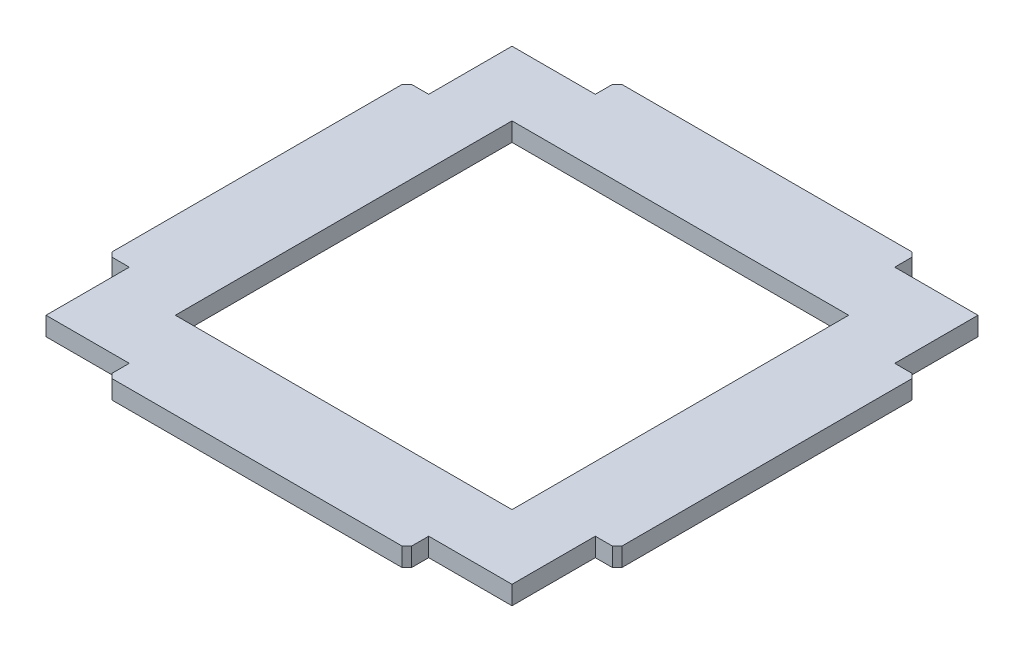
ISO-10303-21;
HEADER;
FILE_DESCRIPTION(('STEP AP214'),'2;1');
FILE_NAME('part.step','',(''),(''),'','','');
FILE_SCHEMA(('AUTOMOTIVE_DESIGN { 1 0 10303 214 1 1 1 1 }'));
ENDSEC;
DATA;
#1=APPLICATION_CONTEXT('core data for automotive mechanical design processes');
#2=APPLICATION_PROTOCOL_DEFINITION('international standard','automotive_design',2000,#1);
#3=PRODUCT_CONTEXT('',#1,'mechanical');
#4=PRODUCT('Part','Part','',(#3));
#5=PRODUCT_RELATED_PRODUCT_CATEGORY('part','',(#4));
#6=PRODUCT_DEFINITION_FORMATION('','',#4);
#7=PRODUCT_DEFINITION_CONTEXT('part definition',#1,'design');
#8=PRODUCT_DEFINITION('design','',#6,#7);
#9=PRODUCT_DEFINITION_SHAPE('','',#8);
#10=(LENGTH_UNIT() NAMED_UNIT(*) SI_UNIT(.MILLI.,.METRE.));
#11=(NAMED_UNIT(*) PLANE_ANGLE_UNIT() SI_UNIT($,.RADIAN.));
#12=(NAMED_UNIT(*) SI_UNIT($,.STERADIAN.) SOLID_ANGLE_UNIT());
#13=UNCERTAINTY_MEASURE_WITH_UNIT(LENGTH_MEASURE(1.E-05),#10,'distance_accuracy_value','');
#14=(GEOMETRIC_REPRESENTATION_CONTEXT(3) GLOBAL_UNCERTAINTY_ASSIGNED_CONTEXT((#13)) GLOBAL_UNIT_ASSIGNED_CONTEXT((#10,
#11,#12)) REPRESENTATION_CONTEXT('',''));
#15=CARTESIAN_POINT('',(0.,0.,0.));
#16=DIRECTION('',(0.,0.,1.));
#17=DIRECTION('',(1.,0.,0.));
#18=AXIS2_PLACEMENT_3D('',#15,#16,#17);
#19=CARTESIAN_POINT('',(0.,4.064,0.));
#20=DIRECTION('',(0.,-1.,0.));
#21=DIRECTION('',(0.,0.,-1.));
#22=AXIS2_PLACEMENT_3D('',#19,#20,#21);
#23=PLANE('',#22);
#24=DIRECTION('',(0.,0.,1.));
#25=VECTOR('',#24,1.);
#26=CARTESIAN_POINT('',(417.83,4.064,-32.6389999999995));
#27=LINE('',#26,#25);
#28=CARTESIAN_POINT('',(417.83,4.064,-31.6229999999996));
#29=VERTEX_POINT('',#28);
#30=CARTESIAN_POINT('',(417.83,4.064,31.6229999999998));
#31=VERTEX_POINT('',#30);
#32=EDGE_CURVE('E320',#29,#31,#27,.T.);
#33=ORIENTED_EDGE('',*,*,#32,.T.);
#34=DIRECTION('',(-0.707106781186552,0.,-0.707106781186543));
#35=VECTOR('',#34,1.);
#36=CARTESIAN_POINT('',(418.846000000001,4.064,32.6389999999998));
#37=LINE('',#36,#35);
#38=CARTESIAN_POINT('',(418.846000000001,4.064,32.6389999999998));
#39=VERTEX_POINT('',#38);
#40=EDGE_CURVE('E455',#31,#39,#37,.F.);
#41=ORIENTED_EDGE('',*,*,#40,.T.);
#42=DIRECTION('',(1.,0.,0.));
#43=VECTOR('',#42,1.);
#44=CARTESIAN_POINT('',(417.83,4.064,32.6389999999998));
#45=LINE('',#44,#43);
#46=CARTESIAN_POINT('',(422.5925,4.064,32.6389999999998));
#47=VERTEX_POINT('',#46);
#48=EDGE_CURVE('E323',#39,#47,#45,.T.);
#49=ORIENTED_EDGE('',*,*,#48,.T.);
#50=DIRECTION('',(0.,0.,1.));
#51=VECTOR('',#50,1.);
#52=CARTESIAN_POINT('',(422.592500000001,4.064,50.8));
#53=LINE('',#52,#51);
#54=CARTESIAN_POINT('',(422.592500000001,4.064,50.8));
#55=VERTEX_POINT('',#54);
#56=EDGE_CURVE('E325',#47,#55,#53,.T.);
#57=ORIENTED_EDGE('',*,*,#56,.T.);
#58=DIRECTION('',(1.,0.,0.));
#59=VECTOR('',#58,1.);
#60=CARTESIAN_POINT('',(440.753500000001,4.064,50.8));
#61=LINE('',#60,#59);
#62=CARTESIAN_POINT('',(440.753500000001,4.064,50.8));
#63=VERTEX_POINT('',#62);
#64=EDGE_CURVE('E327',#55,#63,#61,.T.);
#65=ORIENTED_EDGE('',*,*,#64,.T.);
#66=DIRECTION('',(0.,0.,1.));
#67=VECTOR('',#66,1.);
#68=CARTESIAN_POINT('',(440.753500000001,4.064,55.5625));
#69=LINE('',#68,#67);
#70=CARTESIAN_POINT('',(440.753500000001,4.064,54.5465));
#71=VERTEX_POINT('',#70);
#72=EDGE_CURVE('E329',#63,#71,#69,.T.);
#73=ORIENTED_EDGE('',*,*,#72,.T.);
#74=DIRECTION('',(-0.707106781186552,0.,-0.707106781186543));
#75=VECTOR('',#74,1.);
#76=CARTESIAN_POINT('',(441.769500000001,4.064,55.5625));
#77=LINE('',#76,#75);
#78=CARTESIAN_POINT('',(441.769500000001,4.064,55.5625));
#79=VERTEX_POINT('',#78);
#80=EDGE_CURVE('E453',#71,#79,#77,.F.);
#81=ORIENTED_EDGE('',*,*,#80,.T.);
#82=DIRECTION('',(1.,0.,0.));
#83=VECTOR('',#82,1.);
#84=CARTESIAN_POINT('',(440.753500000001,4.064,55.5625));
#85=LINE('',#84,#83);
#86=CARTESIAN_POINT('',(505.0155,4.064,55.5625));
#87=VERTEX_POINT('',#86);
#88=EDGE_CURVE('E332',#79,#87,#85,.T.);
#89=ORIENTED_EDGE('',*,*,#88,.T.);
#90=DIRECTION('',(-0.707106781186543,0.,0.707106781186552));
#91=VECTOR('',#90,1.);
#92=CARTESIAN_POINT('',(506.0315,4.064,54.5465));
#93=LINE('',#92,#91);
#94=CARTESIAN_POINT('',(506.0315,4.064,54.5465));
#95=VERTEX_POINT('',#94);
#96=EDGE_CURVE('E49',#87,#95,#93,.F.);
#97=ORIENTED_EDGE('',*,*,#96,.T.);
#98=DIRECTION('',(0.,0.,-1.));
#99=VECTOR('',#98,1.);
#100=CARTESIAN_POINT('',(506.0315,4.064,55.5625));
#101=LINE('',#100,#99);
#102=CARTESIAN_POINT('',(506.0315,4.064,50.8));
#103=VERTEX_POINT('',#102);
#104=EDGE_CURVE('E334',#95,#103,#101,.T.);
#105=ORIENTED_EDGE('',*,*,#104,.T.);
#106=DIRECTION('',(1.,0.,0.));
#107=VECTOR('',#106,1.);
#108=CARTESIAN_POINT('',(524.1925,4.064,50.8));
#109=LINE('',#108,#107);
#110=CARTESIAN_POINT('',(524.1925,4.064,50.8));
#111=VERTEX_POINT('',#110);
#112=EDGE_CURVE('E287',#103,#111,#109,.T.);
#113=ORIENTED_EDGE('',*,*,#112,.T.);
#114=DIRECTION('',(0.,0.,-1.));
#115=VECTOR('',#114,1.);
#116=CARTESIAN_POINT('',(524.1925,4.064,32.639));
#117=LINE('',#116,#115);
#118=CARTESIAN_POINT('',(524.1925,4.064,32.639));
#119=VERTEX_POINT('',#118);
#120=EDGE_CURVE('E290',#111,#119,#117,.T.);
#121=ORIENTED_EDGE('',*,*,#120,.T.);
#122=DIRECTION('',(1.,0.,0.));
#123=VECTOR('',#122,1.);
#124=CARTESIAN_POINT('',(528.955,4.064,32.639));
#125=LINE('',#124,#123);
#126=CARTESIAN_POINT('',(527.939,4.064,32.639));
#127=VERTEX_POINT('',#126);
#128=EDGE_CURVE('E293',#119,#127,#125,.T.);
#129=ORIENTED_EDGE('',*,*,#128,.T.);
#130=DIRECTION('',(-0.707106781186567,0.,0.707106781186528));
#131=VECTOR('',#130,1.);
#132=CARTESIAN_POINT('',(528.955,4.064,31.6229999999999));
#133=LINE('',#132,#131);
#134=CARTESIAN_POINT('',(528.955,4.064,31.6229999999999));
#135=VERTEX_POINT('',#134);
#136=EDGE_CURVE('E450',#127,#135,#133,.F.);
#137=ORIENTED_EDGE('',*,*,#136,.T.);
#138=DIRECTION('',(0.,0.,-1.));
#139=VECTOR('',#138,1.);
#140=CARTESIAN_POINT('',(528.955,4.064,32.639));
#141=LINE('',#140,#139);
#142=CARTESIAN_POINT('',(528.955,4.064,-31.6229999999994));
#143=VERTEX_POINT('',#142);
#144=EDGE_CURVE('E296',#135,#143,#141,.T.);
#145=ORIENTED_EDGE('',*,*,#144,.T.);
#146=DIRECTION('',(0.707106781186552,0.,0.707106781186543));
#147=VECTOR('',#146,1.);
#148=CARTESIAN_POINT('',(527.939000000001,4.064,-32.6389999999994));
#149=LINE('',#148,#147);
#150=CARTESIAN_POINT('',(527.939000000001,4.064,-32.6389999999994));
#151=VERTEX_POINT('',#150);
#152=EDGE_CURVE('E448',#143,#151,#149,.F.);
#153=ORIENTED_EDGE('',*,*,#152,.T.);
#154=DIRECTION('',(-1.,0.,0.));
#155=VECTOR('',#154,1.);
#156=CARTESIAN_POINT('',(528.955,4.064,-32.6389999999994));
#157=LINE('',#156,#155);
#158=CARTESIAN_POINT('',(524.1925,4.064,-32.6389999999994));
#159=VERTEX_POINT('',#158);
#160=EDGE_CURVE('E299',#151,#159,#157,.T.);
#161=ORIENTED_EDGE('',*,*,#160,.T.);
#162=DIRECTION('',(0.,0.,-1.));
#163=VECTOR('',#162,1.);
#164=CARTESIAN_POINT('',(524.1925,4.064,-50.8));
#165=LINE('',#164,#163);
#166=CARTESIAN_POINT('',(524.1925,4.064,-50.8));
#167=VERTEX_POINT('',#166);
#168=EDGE_CURVE('E301',#159,#167,#165,.T.);
#169=ORIENTED_EDGE('',*,*,#168,.T.);
#170=DIRECTION('',(-1.,0.,0.));
#171=VECTOR('',#170,1.);
#172=CARTESIAN_POINT('',(506.0315,4.064,-50.8));
#173=LINE('',#172,#171);
#174=CARTESIAN_POINT('',(506.0315,4.064,-50.8));
#175=VERTEX_POINT('',#174);
#176=EDGE_CURVE('E303',#167,#175,#173,.T.);
#177=ORIENTED_EDGE('',*,*,#176,.T.);
#178=DIRECTION('',(0.,0.,-1.));
#179=VECTOR('',#178,1.);
#180=CARTESIAN_POINT('',(506.0315,4.064,-55.5625));
#181=LINE('',#180,#179);
#182=CARTESIAN_POINT('',(506.0315,4.064,-54.5465));
#183=VERTEX_POINT('',#182);
#184=EDGE_CURVE('E305',#175,#183,#181,.T.);
#185=ORIENTED_EDGE('',*,*,#184,.T.);
#186=DIRECTION('',(0.707106781186557,0.,0.707106781186538));
#187=VECTOR('',#186,1.);
#188=CARTESIAN_POINT('',(505.0155,4.064,-55.5625));
#189=LINE('',#188,#187);
#190=CARTESIAN_POINT('',(505.0155,4.064,-55.5625));
#191=VERTEX_POINT('',#190);
#192=EDGE_CURVE('E446',#183,#191,#189,.F.);
#193=ORIENTED_EDGE('',*,*,#192,.T.);
#194=DIRECTION('',(-1.,0.,0.));
#195=VECTOR('',#194,1.);
#196=CARTESIAN_POINT('',(440.753500000001,4.064,-55.5625));
#197=LINE('',#196,#195);
#198=CARTESIAN_POINT('',(441.769500000001,4.064,-55.5625));
#199=VERTEX_POINT('',#198);
#200=EDGE_CURVE('E308',#191,#199,#197,.T.);
#201=ORIENTED_EDGE('',*,*,#200,.T.);
#202=DIRECTION('',(0.707106781186543,0.,-0.707106781186552));
#203=VECTOR('',#202,1.);
#204=CARTESIAN_POINT('',(440.753500000001,4.064,-54.5465));
#205=LINE('',#204,#203);
#206=CARTESIAN_POINT('',(440.753500000001,4.064,-54.5465));
#207=VERTEX_POINT('',#206);
#208=EDGE_CURVE('E442',#199,#207,#205,.F.);
#209=ORIENTED_EDGE('',*,*,#208,.T.);
#210=DIRECTION('',(0.,0.,1.));
#211=VECTOR('',#210,1.);
#212=CARTESIAN_POINT('',(440.753500000001,4.064,-55.5625));
#213=LINE('',#212,#211);
#214=CARTESIAN_POINT('',(440.753500000001,4.064,-50.8));
#215=VERTEX_POINT('',#214);
#216=EDGE_CURVE('E311',#207,#215,#213,.T.);
#217=ORIENTED_EDGE('',*,*,#216,.T.);
#218=DIRECTION('',(-1.,0.,0.));
#219=VECTOR('',#218,1.);
#220=CARTESIAN_POINT('',(422.592500000001,4.064,-50.8));
#221=LINE('',#220,#219);
#222=CARTESIAN_POINT('',(422.592500000001,4.064,-50.8));
#223=VERTEX_POINT('',#222);
#224=EDGE_CURVE('E313',#215,#223,#221,.T.);
#225=ORIENTED_EDGE('',*,*,#224,.T.);
#226=DIRECTION('',(0.,0.,1.));
#227=VECTOR('',#226,1.);
#228=CARTESIAN_POINT('',(422.5925,4.064,-32.6389999999995));
#229=LINE('',#228,#227);
#230=CARTESIAN_POINT('',(422.5925,4.064,-32.6389999999995));
#231=VERTEX_POINT('',#230);
#232=EDGE_CURVE('E315',#223,#231,#229,.T.);
#233=ORIENTED_EDGE('',*,*,#232,.T.);
#234=DIRECTION('',(-1.,0.,0.));
#235=VECTOR('',#234,1.);
#236=CARTESIAN_POINT('',(417.83,4.064,-32.6389999999995));
#237=LINE('',#236,#235);
#238=CARTESIAN_POINT('',(418.846,4.064,-32.6389999999995));
#239=VERTEX_POINT('',#238);
#240=EDGE_CURVE('E317',#231,#239,#237,.T.);
#241=ORIENTED_EDGE('',*,*,#240,.T.);
#242=DIRECTION('',(0.707106781186543,0.,-0.707106781186552));
#243=VECTOR('',#242,1.);
#244=CARTESIAN_POINT('',(417.83,4.064,-31.6229999999996));
#245=LINE('',#244,#243);
#246=EDGE_CURVE('E444',#239,#29,#245,.F.);
#247=ORIENTED_EDGE('',*,*,#246,.T.);
#248=EDGE_LOOP('',(#33,#41,#49,#57,#65,#73,#81,#89,#97,#105,#113,#121,#129,#137,#145,#153,#161,
#169,#177,#185,#193,#201,#209,#217,#225,#233,#241,#247));
#249=FACE_BOUND('',#248,.T.);
#250=DIRECTION('',(0.,0.,1.));
#251=VECTOR('',#250,1.);
#252=CARTESIAN_POINT('',(436.689500000001,4.064,-36.7029999999998));
#253=LINE('',#252,#251);
#254=CARTESIAN_POINT('',(436.689500000001,4.064,-36.7029999999998));
#255=VERTEX_POINT('',#254);
#256=CARTESIAN_POINT('',(436.689500000001,4.064,36.703));
#257=VERTEX_POINT('',#256);
#258=EDGE_CURVE('E246',#255,#257,#253,.T.);
#259=ORIENTED_EDGE('',*,*,#258,.F.);
#260=DIRECTION('',(-1.,0.,0.));
#261=VECTOR('',#260,1.);
#262=CARTESIAN_POINT('',(510.0955,4.064,-36.7029999999999));
#263=LINE('',#262,#261);
#264=CARTESIAN_POINT('',(510.0955,4.064,-36.7029999999999));
#265=VERTEX_POINT('',#264);
#266=EDGE_CURVE('E271',#265,#255,#263,.T.);
#267=ORIENTED_EDGE('',*,*,#266,.F.);
#268=DIRECTION('',(0.,0.,-1.));
#269=VECTOR('',#268,1.);
#270=CARTESIAN_POINT('',(510.0955,4.064,-36.7029999999999));
#271=LINE('',#270,#269);
#272=CARTESIAN_POINT('',(510.0955,4.064,36.703));
#273=VERTEX_POINT('',#272);
#274=EDGE_CURVE('E269',#273,#265,#271,.T.);
#275=ORIENTED_EDGE('',*,*,#274,.F.);
#276=DIRECTION('',(1.,0.,0.));
#277=VECTOR('',#276,1.);
#278=CARTESIAN_POINT('',(510.0955,4.064,36.703));
#279=LINE('',#278,#277);
#280=EDGE_CURVE('E256',#257,#273,#279,.T.);
#281=ORIENTED_EDGE('',*,*,#280,.F.);
#282=EDGE_LOOP('',(#259,#267,#275,#281));
#283=FACE_BOUND('',#282,.T.);
#284=ADVANCED_FACE('F34',(#249,#283),#23,.F.);
#285=CARTESIAN_POINT('',(0.,0.,0.));
#286=DIRECTION('',(0.,-1.,0.));
#287=DIRECTION('',(0.,0.,-1.));
#288=AXIS2_PLACEMENT_3D('',#285,#286,#287);
#289=PLANE('',#288);
#290=DIRECTION('',(1.,0.,0.));
#291=VECTOR('',#290,1.);
#292=CARTESIAN_POINT('',(417.83,0.,32.6389999999998));
#293=LINE('',#292,#291);
#294=CARTESIAN_POINT('',(418.846000000001,0.,32.6389999999998));
#295=VERTEX_POINT('',#294);
#296=CARTESIAN_POINT('',(422.5925,0.,32.6389999999998));
#297=VERTEX_POINT('',#296);
#298=EDGE_CURVE('E371',#295,#297,#293,.T.);
#299=ORIENTED_EDGE('',*,*,#298,.F.);
#300=DIRECTION('',(0.707106781186552,0.,0.707106781186543));
#301=VECTOR('',#300,1.);
#302=CARTESIAN_POINT('',(193.103499999997,0.,-193.1035));
#303=LINE('',#302,#301);
#304=CARTESIAN_POINT('',(417.83,0.,31.6229999999998));
#305=VERTEX_POINT('',#304);
#306=EDGE_CURVE('E435',#295,#305,#303,.F.);
#307=ORIENTED_EDGE('',*,*,#306,.T.);
#308=DIRECTION('',(0.,0.,1.));
#309=VECTOR('',#308,1.);
#310=CARTESIAN_POINT('',(417.83,0.,-32.6389999999995));
#311=LINE('',#310,#309);
#312=CARTESIAN_POINT('',(417.83,0.,-31.6229999999996));
#313=VERTEX_POINT('',#312);
#314=EDGE_CURVE('E368',#313,#305,#311,.T.);
#315=ORIENTED_EDGE('',*,*,#314,.F.);
#316=DIRECTION('',(-0.707106781186543,0.,0.707106781186552));
#317=VECTOR('',#316,1.);
#318=CARTESIAN_POINT('',(193.103500000003,0.,193.103500000001));
#319=LINE('',#318,#317);
#320=CARTESIAN_POINT('',(418.846,0.,-32.6389999999995));
#321=VERTEX_POINT('',#320);
#322=EDGE_CURVE('E423',#313,#321,#319,.F.);
#323=ORIENTED_EDGE('',*,*,#322,.T.);
#324=DIRECTION('',(-1.,0.,0.));
#325=VECTOR('',#324,1.);
#326=CARTESIAN_POINT('',(417.83,0.,-32.6389999999995));
#327=LINE('',#326,#325);
#328=CARTESIAN_POINT('',(422.5925,0.,-32.6389999999995));
#329=VERTEX_POINT('',#328);
#330=EDGE_CURVE('E365',#329,#321,#327,.T.);
#331=ORIENTED_EDGE('',*,*,#330,.F.);
#332=DIRECTION('',(0.,0.,1.));
#333=VECTOR('',#332,1.);
#334=CARTESIAN_POINT('',(422.5925,0.,-32.6389999999995));
#335=LINE('',#334,#333);
#336=CARTESIAN_POINT('',(422.592500000001,0.,-50.8));
#337=VERTEX_POINT('',#336);
#338=EDGE_CURVE('E363',#337,#329,#335,.T.);
#339=ORIENTED_EDGE('',*,*,#338,.F.);
#340=DIRECTION('',(-1.,0.,0.));
#341=VECTOR('',#340,1.);
#342=CARTESIAN_POINT('',(422.592500000001,0.,-50.8));
#343=LINE('',#342,#341);
#344=CARTESIAN_POINT('',(440.753500000001,0.,-50.8));
#345=VERTEX_POINT('',#344);
#346=EDGE_CURVE('E361',#345,#337,#343,.T.);
#347=ORIENTED_EDGE('',*,*,#346,.F.);
#348=DIRECTION('',(0.,0.,1.));
#349=VECTOR('',#348,1.);
#350=CARTESIAN_POINT('',(440.753500000001,0.,-55.5625));
#351=LINE('',#350,#349);
#352=CARTESIAN_POINT('',(440.753500000001,0.,-54.5465));
#353=VERTEX_POINT('',#352);
#354=EDGE_CURVE('E359',#353,#345,#351,.T.);
#355=ORIENTED_EDGE('',*,*,#354,.F.);
#356=DIRECTION('',(-0.707106781186543,0.,0.707106781186552));
#357=VECTOR('',#356,1.);
#358=CARTESIAN_POINT('',(193.103500000004,0.,193.103500000001));
#359=LINE('',#358,#357);
#360=CARTESIAN_POINT('',(441.769500000001,0.,-55.5625));
#361=VERTEX_POINT('',#360);
#362=EDGE_CURVE('E421',#353,#361,#359,.F.);
#363=ORIENTED_EDGE('',*,*,#362,.T.);
#364=DIRECTION('',(-1.,0.,0.));
#365=VECTOR('',#364,1.);
#366=CARTESIAN_POINT('',(440.753500000001,0.,-55.5625));
#367=LINE('',#366,#365);
#368=CARTESIAN_POINT('',(505.0155,0.,-55.5625));
#369=VERTEX_POINT('',#368);
#370=EDGE_CURVE('E356',#369,#361,#367,.T.);
#371=ORIENTED_EDGE('',*,*,#370,.F.);
#372=DIRECTION('',(-0.707106781186557,0.,-0.707106781186538));
#373=VECTOR('',#372,1.);
#374=CARTESIAN_POINT('',(280.288999999993,0.,-280.289000000001));
#375=LINE('',#374,#373);
#376=CARTESIAN_POINT('',(506.0315,0.,-54.5465));
#377=VERTEX_POINT('',#376);
#378=EDGE_CURVE('E425',#369,#377,#375,.F.);
#379=ORIENTED_EDGE('',*,*,#378,.T.);
#380=DIRECTION('',(0.,0.,-1.));
#381=VECTOR('',#380,1.);
#382=CARTESIAN_POINT('',(506.0315,0.,-55.5625));
#383=LINE('',#382,#381);
#384=CARTESIAN_POINT('',(506.0315,0.,-50.8));
#385=VERTEX_POINT('',#384);
#386=EDGE_CURVE('E353',#385,#377,#383,.T.);
#387=ORIENTED_EDGE('',*,*,#386,.F.);
#388=DIRECTION('',(-1.,0.,0.));
#389=VECTOR('',#388,1.);
#390=CARTESIAN_POINT('',(506.0315,0.,-50.8));
#391=LINE('',#390,#389);
#392=CARTESIAN_POINT('',(524.1925,0.,-50.8));
#393=VERTEX_POINT('',#392);
#394=EDGE_CURVE('E351',#393,#385,#391,.T.);
#395=ORIENTED_EDGE('',*,*,#394,.F.);
#396=DIRECTION('',(0.,0.,-1.));
#397=VECTOR('',#396,1.);
#398=CARTESIAN_POINT('',(524.1925,0.,-50.8));
#399=LINE('',#398,#397);
#400=CARTESIAN_POINT('',(524.1925,0.,-32.6389999999994));
#401=VERTEX_POINT('',#400);
#402=EDGE_CURVE('E349',#401,#393,#399,.T.);
#403=ORIENTED_EDGE('',*,*,#402,.F.);
#404=DIRECTION('',(-1.,0.,0.));
#405=VECTOR('',#404,1.);
#406=CARTESIAN_POINT('',(528.955,0.,-32.6389999999994));
#407=LINE('',#406,#405);
#408=CARTESIAN_POINT('',(527.939000000001,0.,-32.6389999999994));
#409=VERTEX_POINT('',#408);
#410=EDGE_CURVE('E347',#409,#401,#407,.T.);
#411=ORIENTED_EDGE('',*,*,#410,.F.);
#412=DIRECTION('',(-0.707106781186552,0.,-0.707106781186543));
#413=VECTOR('',#412,1.);
#414=CARTESIAN_POINT('',(280.288999999996,0.,-280.289));
#415=LINE('',#414,#413);
#416=CARTESIAN_POINT('',(528.955,0.,-31.6229999999994));
#417=VERTEX_POINT('',#416);
#418=EDGE_CURVE('E427',#409,#417,#415,.F.);
#419=ORIENTED_EDGE('',*,*,#418,.T.);
#420=DIRECTION('',(0.,0.,-1.));
#421=VECTOR('',#420,1.);
#422=CARTESIAN_POINT('',(528.955,0.,32.639));
#423=LINE('',#422,#421);
#424=CARTESIAN_POINT('',(528.955,0.,31.6229999999999));
#425=VERTEX_POINT('',#424);
#426=EDGE_CURVE('E344',#425,#417,#423,.T.);
#427=ORIENTED_EDGE('',*,*,#426,.F.);
#428=DIRECTION('',(0.707106781186567,0.,-0.707106781186528));
#429=VECTOR('',#428,1.);
#430=CARTESIAN_POINT('',(280.288999999986,0.,280.289000000001));
#431=LINE('',#430,#429);
#432=CARTESIAN_POINT('',(527.939,0.,32.639));
#433=VERTEX_POINT('',#432);
#434=EDGE_CURVE('E429',#425,#433,#431,.F.);
#435=ORIENTED_EDGE('',*,*,#434,.T.);
#436=DIRECTION('',(1.,0.,0.));
#437=VECTOR('',#436,1.);
#438=CARTESIAN_POINT('',(528.955,0.,32.639));
#439=LINE('',#438,#437);
#440=CARTESIAN_POINT('',(524.1925,0.,32.639));
#441=VERTEX_POINT('',#440);
#442=EDGE_CURVE('E341',#441,#433,#439,.T.);
#443=ORIENTED_EDGE('',*,*,#442,.F.);
#444=DIRECTION('',(0.,0.,-1.));
#445=VECTOR('',#444,1.);
#446=CARTESIAN_POINT('',(524.1925,0.,32.639));
#447=LINE('',#446,#445);
#448=CARTESIAN_POINT('',(524.1925,0.,50.8));
#449=VERTEX_POINT('',#448);
#450=EDGE_CURVE('E339',#449,#441,#447,.T.);
#451=ORIENTED_EDGE('',*,*,#450,.F.);
#452=DIRECTION('',(1.,0.,0.));
#453=VECTOR('',#452,1.);
#454=CARTESIAN_POINT('',(524.1925,0.,50.8));
#455=LINE('',#454,#453);
#456=CARTESIAN_POINT('',(506.0315,0.,50.8));
#457=VERTEX_POINT('',#456);
#458=EDGE_CURVE('E264',#457,#449,#455,.T.);
#459=ORIENTED_EDGE('',*,*,#458,.F.);
#460=DIRECTION('',(0.,0.,-1.));
#461=VECTOR('',#460,1.);
#462=CARTESIAN_POINT('',(506.0315,0.,55.5625));
#463=LINE('',#462,#461);
#464=CARTESIAN_POINT('',(506.0315,0.,54.5465));
#465=VERTEX_POINT('',#464);
#466=EDGE_CURVE('E291',#465,#457,#463,.T.);
#467=ORIENTED_EDGE('',*,*,#466,.F.);
#468=DIRECTION('',(0.707106781186543,0.,-0.707106781186552));
#469=VECTOR('',#468,1.);
#470=CARTESIAN_POINT('',(280.289000000004,0.,280.289));
#471=LINE('',#470,#469);
#472=CARTESIAN_POINT('',(505.0155,0.,55.5625));
#473=VERTEX_POINT('',#472);
#474=EDGE_CURVE('E431',#465,#473,#471,.F.);
#475=ORIENTED_EDGE('',*,*,#474,.T.);
#476=DIRECTION('',(1.,0.,0.));
#477=VECTOR('',#476,1.);
#478=CARTESIAN_POINT('',(440.753500000001,0.,55.5625));
#479=LINE('',#478,#477);
#480=CARTESIAN_POINT('',(441.769500000001,0.,55.5625));
#481=VERTEX_POINT('',#480);
#482=EDGE_CURVE('E380',#481,#473,#479,.T.);
#483=ORIENTED_EDGE('',*,*,#482,.F.);
#484=DIRECTION('',(0.707106781186552,0.,0.707106781186543));
#485=VECTOR('',#484,1.);
#486=CARTESIAN_POINT('',(193.103499999997,0.,-193.1035));
#487=LINE('',#486,#485);
#488=CARTESIAN_POINT('',(440.753500000001,0.,54.5465));
#489=VERTEX_POINT('',#488);
#490=EDGE_CURVE('E433',#481,#489,#487,.F.);
#491=ORIENTED_EDGE('',*,*,#490,.T.);
#492=DIRECTION('',(0.,0.,1.));
#493=VECTOR('',#492,1.);
#494=CARTESIAN_POINT('',(440.753500000001,0.,55.5625));
#495=LINE('',#494,#493);
#496=CARTESIAN_POINT('',(440.753500000001,0.,50.8));
#497=VERTEX_POINT('',#496);
#498=EDGE_CURVE('E377',#497,#489,#495,.T.);
#499=ORIENTED_EDGE('',*,*,#498,.F.);
#500=DIRECTION('',(1.,0.,0.));
#501=VECTOR('',#500,1.);
#502=CARTESIAN_POINT('',(440.753500000001,0.,50.8));
#503=LINE('',#502,#501);
#504=CARTESIAN_POINT('',(422.592500000001,0.,50.8));
#505=VERTEX_POINT('',#504);
#506=EDGE_CURVE('E375',#505,#497,#503,.T.);
#507=ORIENTED_EDGE('',*,*,#506,.F.);
#508=DIRECTION('',(0.,0.,1.));
#509=VECTOR('',#508,1.);
#510=CARTESIAN_POINT('',(422.592500000001,0.,50.8));
#511=LINE('',#510,#509);
#512=EDGE_CURVE('E373',#297,#505,#511,.T.);
#513=ORIENTED_EDGE('',*,*,#512,.F.);
#514=EDGE_LOOP('',(#299,#307,#315,#323,#331,#339,#347,#355,#363,#371,#379,#387,#395,#403,#411,
#419,#427,#435,#443,#451,#459,#467,#475,#483,#491,#499,#507,#513));
#515=FACE_BOUND('',#514,.T.);
#516=DIRECTION('',(-1.,0.,0.));
#517=VECTOR('',#516,1.);
#518=CARTESIAN_POINT('',(510.0955,0.,-36.7029999999999));
#519=LINE('',#518,#517);
#520=CARTESIAN_POINT('',(510.0955,0.,-36.7029999999999));
#521=VERTEX_POINT('',#520);
#522=CARTESIAN_POINT('',(436.689500000001,0.,-36.7029999999998));
#523=VERTEX_POINT('',#522);
#524=EDGE_CURVE('E257',#521,#523,#519,.T.);
#525=ORIENTED_EDGE('',*,*,#524,.T.);
#526=DIRECTION('',(0.,0.,1.));
#527=VECTOR('',#526,1.);
#528=CARTESIAN_POINT('',(436.689500000001,0.,-36.7029999999998));
#529=LINE('',#528,#527);
#530=CARTESIAN_POINT('',(436.689500000001,0.,36.703));
#531=VERTEX_POINT('',#530);
#532=EDGE_CURVE('E275',#523,#531,#529,.T.);
#533=ORIENTED_EDGE('',*,*,#532,.T.);
#534=DIRECTION('',(1.,0.,0.));
#535=VECTOR('',#534,1.);
#536=CARTESIAN_POINT('',(510.0955,0.,36.703));
#537=LINE('',#536,#535);
#538=CARTESIAN_POINT('',(510.0955,0.,36.703));
#539=VERTEX_POINT('',#538);
#540=EDGE_CURVE('E263',#531,#539,#537,.T.);
#541=ORIENTED_EDGE('',*,*,#540,.T.);
#542=DIRECTION('',(0.,0.,-1.));
#543=VECTOR('',#542,1.);
#544=CARTESIAN_POINT('',(510.0955,0.,-36.7029999999999));
#545=LINE('',#544,#543);
#546=EDGE_CURVE('E278',#539,#521,#545,.T.);
#547=ORIENTED_EDGE('',*,*,#546,.T.);
#548=EDGE_LOOP('',(#525,#533,#541,#547));
#549=FACE_BOUND('',#548,.T.);
#550=ADVANCED_FACE('F500',(#515,#549),#289,.T.);
#551=CARTESIAN_POINT('',(524.1925,4.064,50.8));
#552=DIRECTION('',(0.,0.,-1.));
#553=DIRECTION('',(-1.,0.,0.));
#554=AXIS2_PLACEMENT_3D('',#551,#552,#553);
#555=PLANE('',#554);
#556=ORIENTED_EDGE('',*,*,#458,.T.);
#557=DIRECTION('',(0.,-1.,0.));
#558=VECTOR('',#557,1.);
#559=CARTESIAN_POINT('',(524.1925,4.064,50.8));
#560=LINE('',#559,#558);
#561=EDGE_CURVE('E415',#111,#449,#560,.T.);
#562=ORIENTED_EDGE('',*,*,#561,.F.);
#563=ORIENTED_EDGE('',*,*,#112,.F.);
#564=DIRECTION('',(0.,-1.,0.));
#565=VECTOR('',#564,1.);
#566=CARTESIAN_POINT('',(506.0315,4.064,50.8));
#567=LINE('',#566,#565);
#568=EDGE_CURVE('E336',#103,#457,#567,.T.);
#569=ORIENTED_EDGE('',*,*,#568,.T.);
#570=EDGE_LOOP('',(#556,#562,#563,#569));
#571=FACE_BOUND('',#570,.T.);
#572=ADVANCED_FACE('F543',(#571),#555,.F.);
#573=CARTESIAN_POINT('',(524.1925,4.064,32.639));
#574=DIRECTION('',(-1.,0.,0.));
#575=DIRECTION('',(0.,0.,1.));
#576=AXIS2_PLACEMENT_3D('',#573,#574,#575);
#577=PLANE('',#576);
#578=ORIENTED_EDGE('',*,*,#450,.T.);
#579=DIRECTION('',(0.,-1.,0.));
#580=VECTOR('',#579,1.);
#581=CARTESIAN_POINT('',(524.1925,4.064,32.639));
#582=LINE('',#581,#580);
#583=EDGE_CURVE('E412',#119,#441,#582,.T.);
#584=ORIENTED_EDGE('',*,*,#583,.F.);
#585=ORIENTED_EDGE('',*,*,#120,.F.);
#586=ORIENTED_EDGE('',*,*,#561,.T.);
#587=EDGE_LOOP('',(#578,#584,#585,#586));
#588=FACE_BOUND('',#587,.T.);
#589=ADVANCED_FACE('F545',(#588),#577,.F.);
#590=CARTESIAN_POINT('',(528.955,4.064,32.639));
#591=DIRECTION('',(0.,0.,-1.));
#592=DIRECTION('',(-1.,0.,0.));
#593=AXIS2_PLACEMENT_3D('',#590,#591,#592);
#594=PLANE('',#593);
#595=ORIENTED_EDGE('',*,*,#442,.T.);
#596=DIRECTION('',(0.,1.,0.));
#597=VECTOR('',#596,1.);
#598=CARTESIAN_POINT('',(527.939,4.064,32.639));
#599=LINE('',#598,#597);
#600=EDGE_CURVE('E471',#433,#127,#599,.T.);
#601=ORIENTED_EDGE('',*,*,#600,.T.);
#602=ORIENTED_EDGE('',*,*,#128,.F.);
#603=ORIENTED_EDGE('',*,*,#583,.T.);
#604=EDGE_LOOP('',(#595,#601,#602,#603));
#605=FACE_BOUND('',#604,.T.);
#606=ADVANCED_FACE('F549',(#605),#594,.F.);
#607=CARTESIAN_POINT('',(528.955,4.064,32.639));
#608=DIRECTION('',(-1.,0.,0.));
#609=DIRECTION('',(0.,0.,1.));
#610=AXIS2_PLACEMENT_3D('',#607,#608,#609);
#611=PLANE('',#610);
#612=ORIENTED_EDGE('',*,*,#144,.F.);
#613=DIRECTION('',(0.,-1.,0.));
#614=VECTOR('',#613,1.);
#615=CARTESIAN_POINT('',(528.955,4.064,31.6229999999999));
#616=LINE('',#615,#614);
#617=EDGE_CURVE('E468',#135,#425,#616,.T.);
#618=ORIENTED_EDGE('',*,*,#617,.T.);
#619=ORIENTED_EDGE('',*,*,#426,.T.);
#620=DIRECTION('',(0.,1.,0.));
#621=VECTOR('',#620,1.);
#622=CARTESIAN_POINT('',(528.955,4.064,-31.6229999999994));
#623=LINE('',#622,#621);
#624=EDGE_CURVE('E466',#417,#143,#623,.T.);
#625=ORIENTED_EDGE('',*,*,#624,.T.);
#626=EDGE_LOOP('',(#612,#618,#619,#625));
#627=FACE_BOUND('',#626,.T.);
#628=ADVANCED_FACE('F558',(#627),#611,.F.);
#629=CARTESIAN_POINT('',(528.955,4.064,-32.6389999999994));
#630=DIRECTION('',(0.,0.,1.));
#631=DIRECTION('',(1.,0.,0.));
#632=AXIS2_PLACEMENT_3D('',#629,#630,#631);
#633=PLANE('',#632);
#634=ORIENTED_EDGE('',*,*,#160,.F.);
#635=DIRECTION('',(0.,-1.,0.));
#636=VECTOR('',#635,1.);
#637=CARTESIAN_POINT('',(527.939000000001,4.064,-32.6389999999994));
#638=LINE('',#637,#636);
#639=EDGE_CURVE('E473',#151,#409,#638,.T.);
#640=ORIENTED_EDGE('',*,*,#639,.T.);
#641=ORIENTED_EDGE('',*,*,#410,.T.);
#642=DIRECTION('',(0.,-1.,0.));
#643=VECTOR('',#642,1.);
#644=CARTESIAN_POINT('',(524.1925,4.064,-32.6389999999994));
#645=LINE('',#644,#643);
#646=EDGE_CURVE('E409',#159,#401,#645,.T.);
#647=ORIENTED_EDGE('',*,*,#646,.F.);
#648=EDGE_LOOP('',(#634,#640,#641,#647));
#649=FACE_BOUND('',#648,.T.);
#650=ADVANCED_FACE('F568',(#649),#633,.F.);
#651=CARTESIAN_POINT('',(524.1925,4.064,-50.8));
#652=DIRECTION('',(-1.,0.,0.));
#653=DIRECTION('',(0.,0.,1.));
#654=AXIS2_PLACEMENT_3D('',#651,#652,#653);
#655=PLANE('',#654);
#656=ORIENTED_EDGE('',*,*,#402,.T.);
#657=DIRECTION('',(0.,-1.,0.));
#658=VECTOR('',#657,1.);
#659=CARTESIAN_POINT('',(524.1925,4.064,-50.8));
#660=LINE('',#659,#658);
#661=EDGE_CURVE('E406',#167,#393,#660,.T.);
#662=ORIENTED_EDGE('',*,*,#661,.F.);
#663=ORIENTED_EDGE('',*,*,#168,.F.);
#664=ORIENTED_EDGE('',*,*,#646,.T.);
#665=EDGE_LOOP('',(#656,#662,#663,#664));
#666=FACE_BOUND('',#665,.T.);
#667=ADVANCED_FACE('F575',(#666),#655,.F.);
#668=CARTESIAN_POINT('',(506.0315,4.064,-50.8));
#669=DIRECTION('',(0.,0.,1.));
#670=DIRECTION('',(1.,0.,0.));
#671=AXIS2_PLACEMENT_3D('',#668,#669,#670);
#672=PLANE('',#671);
#673=ORIENTED_EDGE('',*,*,#394,.T.);
#674=DIRECTION('',(0.,-1.,0.));
#675=VECTOR('',#674,1.);
#676=CARTESIAN_POINT('',(506.0315,4.064,-50.8));
#677=LINE('',#676,#675);
#678=EDGE_CURVE('E403',#175,#385,#677,.T.);
#679=ORIENTED_EDGE('',*,*,#678,.F.);
#680=ORIENTED_EDGE('',*,*,#176,.F.);
#681=ORIENTED_EDGE('',*,*,#661,.T.);
#682=EDGE_LOOP('',(#673,#679,#680,#681));
#683=FACE_BOUND('',#682,.T.);
#684=ADVANCED_FACE('F578',(#683),#672,.F.);
#685=CARTESIAN_POINT('',(506.0315,4.064,-55.5625));
#686=DIRECTION('',(-1.,0.,0.));
#687=DIRECTION('',(0.,0.,1.));
#688=AXIS2_PLACEMENT_3D('',#685,#686,#687);
#689=PLANE('',#688);
#690=ORIENTED_EDGE('',*,*,#386,.T.);
#691=DIRECTION('',(0.,1.,0.));
#692=VECTOR('',#691,1.);
#693=CARTESIAN_POINT('',(506.0315,4.064,-54.5465));
#694=LINE('',#693,#692);
#695=EDGE_CURVE('E481',#377,#183,#694,.T.);
#696=ORIENTED_EDGE('',*,*,#695,.T.);
#697=ORIENTED_EDGE('',*,*,#184,.F.);
#698=ORIENTED_EDGE('',*,*,#678,.T.);
#699=EDGE_LOOP('',(#690,#696,#697,#698));
#700=FACE_BOUND('',#699,.T.);
#701=ADVANCED_FACE('F582',(#700),#689,.F.);
#702=CARTESIAN_POINT('',(440.753500000001,4.064,-55.5625));
#703=DIRECTION('',(0.,0.,1.));
#704=DIRECTION('',(1.,0.,0.));
#705=AXIS2_PLACEMENT_3D('',#702,#703,#704);
#706=PLANE('',#705);
#707=ORIENTED_EDGE('',*,*,#200,.F.);
#708=DIRECTION('',(0.,-1.,0.));
#709=VECTOR('',#708,1.);
#710=CARTESIAN_POINT('',(505.0155,4.064,-55.5625));
#711=LINE('',#710,#709);
#712=EDGE_CURVE('E478',#191,#369,#711,.T.);
#713=ORIENTED_EDGE('',*,*,#712,.T.);
#714=ORIENTED_EDGE('',*,*,#370,.T.);
#715=DIRECTION('',(0.,1.,0.));
#716=VECTOR('',#715,1.);
#717=CARTESIAN_POINT('',(441.769500000001,4.064,-55.5625));
#718=LINE('',#717,#716);
#719=EDGE_CURVE('E476',#361,#199,#718,.T.);
#720=ORIENTED_EDGE('',*,*,#719,.T.);
#721=EDGE_LOOP('',(#707,#713,#714,#720));
#722=FACE_BOUND('',#721,.T.);
#723=ADVANCED_FACE('F591',(#722),#706,.F.);
#724=CARTESIAN_POINT('',(440.753500000001,4.064,-55.5625));
#725=DIRECTION('',(1.,0.,0.));
#726=DIRECTION('',(0.,0.,-1.));
#727=AXIS2_PLACEMENT_3D('',#724,#725,#726);
#728=PLANE('',#727);
#729=ORIENTED_EDGE('',*,*,#216,.F.);
#730=DIRECTION('',(0.,-1.,0.));
#731=VECTOR('',#730,1.);
#732=CARTESIAN_POINT('',(440.753500000001,4.064,-54.5465));
#733=LINE('',#732,#731);
#734=EDGE_CURVE('E11',#207,#353,#733,.T.);
#735=ORIENTED_EDGE('',*,*,#734,.T.);
#736=ORIENTED_EDGE('',*,*,#354,.T.);
#737=DIRECTION('',(0.,-1.,0.));
#738=VECTOR('',#737,1.);
#739=CARTESIAN_POINT('',(440.753500000001,4.064,-50.8));
#740=LINE('',#739,#738);
#741=EDGE_CURVE('E400',#215,#345,#740,.T.);
#742=ORIENTED_EDGE('',*,*,#741,.F.);
#743=EDGE_LOOP('',(#729,#735,#736,#742));
#744=FACE_BOUND('',#743,.T.);
#745=ADVANCED_FACE('F600',(#744),#728,.F.);
#746=CARTESIAN_POINT('',(422.592500000001,4.064,-50.8));
#747=DIRECTION('',(0.,0.,1.));
#748=DIRECTION('',(1.,0.,0.));
#749=AXIS2_PLACEMENT_3D('',#746,#747,#748);
#750=PLANE('',#749);
#751=ORIENTED_EDGE('',*,*,#346,.T.);
#752=DIRECTION('',(0.,-1.,0.));
#753=VECTOR('',#752,1.);
#754=CARTESIAN_POINT('',(422.592500000001,4.064,-50.8));
#755=LINE('',#754,#753);
#756=EDGE_CURVE('E397',#223,#337,#755,.T.);
#757=ORIENTED_EDGE('',*,*,#756,.F.);
#758=ORIENTED_EDGE('',*,*,#224,.F.);
#759=ORIENTED_EDGE('',*,*,#741,.T.);
#760=EDGE_LOOP('',(#751,#757,#758,#759));
#761=FACE_BOUND('',#760,.T.);
#762=ADVANCED_FACE('F605',(#761),#750,.F.);
#763=CARTESIAN_POINT('',(422.5925,4.064,-32.6389999999995));
#764=DIRECTION('',(1.,0.,0.));
#765=DIRECTION('',(0.,0.,-1.));
#766=AXIS2_PLACEMENT_3D('',#763,#764,#765);
#767=PLANE('',#766);
#768=ORIENTED_EDGE('',*,*,#338,.T.);
#769=DIRECTION('',(0.,-1.,0.));
#770=VECTOR('',#769,1.);
#771=CARTESIAN_POINT('',(422.5925,4.064,-32.6389999999995));
#772=LINE('',#771,#770);
#773=EDGE_CURVE('E394',#231,#329,#772,.T.);
#774=ORIENTED_EDGE('',*,*,#773,.F.);
#775=ORIENTED_EDGE('',*,*,#232,.F.);
#776=ORIENTED_EDGE('',*,*,#756,.T.);
#777=EDGE_LOOP('',(#768,#774,#775,#776));
#778=FACE_BOUND('',#777,.T.);
#779=ADVANCED_FACE('F608',(#778),#767,.F.);
#780=CARTESIAN_POINT('',(417.83,4.064,-32.6389999999995));
#781=DIRECTION('',(0.,0.,1.));
#782=DIRECTION('',(1.,0.,0.));
#783=AXIS2_PLACEMENT_3D('',#780,#781,#782);
#784=PLANE('',#783);
#785=ORIENTED_EDGE('',*,*,#330,.T.);
#786=DIRECTION('',(0.,1.,0.));
#787=VECTOR('',#786,1.);
#788=CARTESIAN_POINT('',(418.846,4.064,-32.6389999999995));
#789=LINE('',#788,#787);
#790=EDGE_CURVE('E42',#321,#239,#789,.T.);
#791=ORIENTED_EDGE('',*,*,#790,.T.);
#792=ORIENTED_EDGE('',*,*,#240,.F.);
#793=ORIENTED_EDGE('',*,*,#773,.T.);
#794=EDGE_LOOP('',(#785,#791,#792,#793));
#795=FACE_BOUND('',#794,.T.);
#796=ADVANCED_FACE('F485',(#795),#784,.F.);
#797=CARTESIAN_POINT('',(417.83,4.064,-32.6389999999995));
#798=DIRECTION('',(1.,0.,0.));
#799=DIRECTION('',(0.,0.,-1.));
#800=AXIS2_PLACEMENT_3D('',#797,#798,#799);
#801=PLANE('',#800);
#802=ORIENTED_EDGE('',*,*,#314,.T.);
#803=DIRECTION('',(0.,1.,0.));
#804=VECTOR('',#803,1.);
#805=CARTESIAN_POINT('',(417.83,4.064,31.6229999999998));
#806=LINE('',#805,#804);
#807=EDGE_CURVE('E440',#305,#31,#806,.T.);
#808=ORIENTED_EDGE('',*,*,#807,.T.);
#809=ORIENTED_EDGE('',*,*,#32,.F.);
#810=DIRECTION('',(0.,-1.,0.));
#811=VECTOR('',#810,1.);
#812=CARTESIAN_POINT('',(417.83,4.064,-31.6229999999996));
#813=LINE('',#812,#811);
#814=EDGE_CURVE('E437',#29,#313,#813,.T.);
#815=ORIENTED_EDGE('',*,*,#814,.T.);
#816=EDGE_LOOP('',(#802,#808,#809,#815));
#817=FACE_BOUND('',#816,.T.);
#818=ADVANCED_FACE('F496',(#817),#801,.F.);
#819=CARTESIAN_POINT('',(417.83,4.064,32.6389999999998));
#820=DIRECTION('',(0.,0.,-1.));
#821=DIRECTION('',(-1.,0.,0.));
#822=AXIS2_PLACEMENT_3D('',#819,#820,#821);
#823=PLANE('',#822);
#824=ORIENTED_EDGE('',*,*,#48,.F.);
#825=DIRECTION('',(0.,-1.,0.));
#826=VECTOR('',#825,1.);
#827=CARTESIAN_POINT('',(418.846000000001,4.064,32.6389999999998));
#828=LINE('',#827,#826);
#829=EDGE_CURVE('E418',#39,#295,#828,.T.);
#830=ORIENTED_EDGE('',*,*,#829,.T.);
#831=ORIENTED_EDGE('',*,*,#298,.T.);
#832=DIRECTION('',(0.,-1.,0.));
#833=VECTOR('',#832,1.);
#834=CARTESIAN_POINT('',(422.5925,4.064,32.6389999999998));
#835=LINE('',#834,#833);
#836=EDGE_CURVE('E391',#47,#297,#835,.T.);
#837=ORIENTED_EDGE('',*,*,#836,.F.);
#838=EDGE_LOOP('',(#824,#830,#831,#837));
#839=FACE_BOUND('',#838,.T.);
#840=ADVANCED_FACE('F509',(#839),#823,.F.);
#841=CARTESIAN_POINT('',(422.592500000001,4.064,50.8));
#842=DIRECTION('',(1.,0.,0.));
#843=DIRECTION('',(0.,0.,-1.));
#844=AXIS2_PLACEMENT_3D('',#841,#842,#843);
#845=PLANE('',#844);
#846=ORIENTED_EDGE('',*,*,#512,.T.);
#847=DIRECTION('',(0.,-1.,0.));
#848=VECTOR('',#847,1.);
#849=CARTESIAN_POINT('',(422.592500000001,4.064,50.8));
#850=LINE('',#849,#848);
#851=EDGE_CURVE('E388',#55,#505,#850,.T.);
#852=ORIENTED_EDGE('',*,*,#851,.F.);
#853=ORIENTED_EDGE('',*,*,#56,.F.);
#854=ORIENTED_EDGE('',*,*,#836,.T.);
#855=EDGE_LOOP('',(#846,#852,#853,#854));
#856=FACE_BOUND('',#855,.T.);
#857=ADVANCED_FACE('F516',(#856),#845,.F.);
#858=CARTESIAN_POINT('',(440.753500000001,4.064,50.8));
#859=DIRECTION('',(0.,0.,-1.));
#860=DIRECTION('',(-1.,0.,0.));
#861=AXIS2_PLACEMENT_3D('',#858,#859,#860);
#862=PLANE('',#861);
#863=ORIENTED_EDGE('',*,*,#506,.T.);
#864=DIRECTION('',(0.,-1.,0.));
#865=VECTOR('',#864,1.);
#866=CARTESIAN_POINT('',(440.753500000001,4.064,50.8));
#867=LINE('',#866,#865);
#868=EDGE_CURVE('E385',#63,#497,#867,.T.);
#869=ORIENTED_EDGE('',*,*,#868,.F.);
#870=ORIENTED_EDGE('',*,*,#64,.F.);
#871=ORIENTED_EDGE('',*,*,#851,.T.);
#872=EDGE_LOOP('',(#863,#869,#870,#871));
#873=FACE_BOUND('',#872,.T.);
#874=ADVANCED_FACE('F519',(#873),#862,.F.);
#875=CARTESIAN_POINT('',(440.753500000001,4.064,55.5625));
#876=DIRECTION('',(1.,0.,0.));
#877=DIRECTION('',(0.,0.,-1.));
#878=AXIS2_PLACEMENT_3D('',#875,#876,#877);
#879=PLANE('',#878);
#880=ORIENTED_EDGE('',*,*,#498,.T.);
#881=DIRECTION('',(0.,1.,0.));
#882=VECTOR('',#881,1.);
#883=CARTESIAN_POINT('',(440.753500000001,4.064,54.5465));
#884=LINE('',#883,#882);
#885=EDGE_CURVE('E461',#489,#71,#884,.T.);
#886=ORIENTED_EDGE('',*,*,#885,.T.);
#887=ORIENTED_EDGE('',*,*,#72,.F.);
#888=ORIENTED_EDGE('',*,*,#868,.T.);
#889=EDGE_LOOP('',(#880,#886,#887,#888));
#890=FACE_BOUND('',#889,.T.);
#891=ADVANCED_FACE('F523',(#890),#879,.F.);
#892=CARTESIAN_POINT('',(440.753500000001,4.064,55.5625));
#893=DIRECTION('',(0.,0.,-1.));
#894=DIRECTION('',(-1.,0.,0.));
#895=AXIS2_PLACEMENT_3D('',#892,#893,#894);
#896=PLANE('',#895);
#897=ORIENTED_EDGE('',*,*,#88,.F.);
#898=DIRECTION('',(0.,-1.,0.));
#899=VECTOR('',#898,1.);
#900=CARTESIAN_POINT('',(441.769500000001,4.064,55.5625));
#901=LINE('',#900,#899);
#902=EDGE_CURVE('E458',#79,#481,#901,.T.);
#903=ORIENTED_EDGE('',*,*,#902,.T.);
#904=ORIENTED_EDGE('',*,*,#482,.T.);
#905=DIRECTION('',(0.,1.,0.));
#906=VECTOR('',#905,1.);
#907=CARTESIAN_POINT('',(505.0155,4.064,55.5625));
#908=LINE('',#907,#906);
#909=EDGE_CURVE('E57',#473,#87,#908,.T.);
#910=ORIENTED_EDGE('',*,*,#909,.T.);
#911=EDGE_LOOP('',(#897,#903,#904,#910));
#912=FACE_BOUND('',#911,.T.);
#913=ADVANCED_FACE('F530',(#912),#896,.F.);
#914=CARTESIAN_POINT('',(506.0315,4.064,55.5625));
#915=DIRECTION('',(-1.,0.,0.));
#916=DIRECTION('',(0.,0.,1.));
#917=AXIS2_PLACEMENT_3D('',#914,#915,#916);
#918=PLANE('',#917);
#919=ORIENTED_EDGE('',*,*,#104,.F.);
#920=DIRECTION('',(0.,-1.,0.));
#921=VECTOR('',#920,1.);
#922=CARTESIAN_POINT('',(506.0315,4.064,54.5465));
#923=LINE('',#922,#921);
#924=EDGE_CURVE('E463',#95,#465,#923,.T.);
#925=ORIENTED_EDGE('',*,*,#924,.T.);
#926=ORIENTED_EDGE('',*,*,#466,.T.);
#927=ORIENTED_EDGE('',*,*,#568,.F.);
#928=EDGE_LOOP('',(#919,#925,#926,#927));
#929=FACE_BOUND('',#928,.T.);
#930=ADVANCED_FACE('F537',(#929),#918,.F.);
#931=CARTESIAN_POINT('',(436.689500000001,4.064,-36.7029999999998));
#932=DIRECTION('',(1.,0.,0.));
#933=DIRECTION('',(0.,0.,-1.));
#934=AXIS2_PLACEMENT_3D('',#931,#932,#933);
#935=PLANE('',#934);
#936=ORIENTED_EDGE('',*,*,#532,.F.);
#937=DIRECTION('',(0.,-1.,0.));
#938=VECTOR('',#937,1.);
#939=CARTESIAN_POINT('',(436.689500000001,4.064,-36.7029999999998));
#940=LINE('',#939,#938);
#941=EDGE_CURVE('E252',#255,#523,#940,.T.);
#942=ORIENTED_EDGE('',*,*,#941,.F.);
#943=ORIENTED_EDGE('',*,*,#258,.T.);
#944=DIRECTION('',(0.,-1.,0.));
#945=VECTOR('',#944,1.);
#946=CARTESIAN_POINT('',(436.689500000001,4.064,36.703));
#947=LINE('',#946,#945);
#948=EDGE_CURVE('E249',#257,#531,#947,.T.);
#949=ORIENTED_EDGE('',*,*,#948,.T.);
#950=EDGE_LOOP('',(#936,#942,#943,#949));
#951=FACE_BOUND('',#950,.T.);
#952=ADVANCED_FACE('F248',(#951),#935,.T.);
#953=CARTESIAN_POINT('',(510.0955,4.064,36.703));
#954=DIRECTION('',(0.,0.,-1.));
#955=DIRECTION('',(-1.,0.,0.));
#956=AXIS2_PLACEMENT_3D('',#953,#954,#955);
#957=PLANE('',#956);
#958=ORIENTED_EDGE('',*,*,#540,.F.);
#959=ORIENTED_EDGE('',*,*,#948,.F.);
#960=ORIENTED_EDGE('',*,*,#280,.T.);
#961=DIRECTION('',(0.,-1.,0.));
#962=VECTOR('',#961,1.);
#963=CARTESIAN_POINT('',(510.0955,4.064,36.703));
#964=LINE('',#963,#962);
#965=EDGE_CURVE('E265',#273,#539,#964,.T.);
#966=ORIENTED_EDGE('',*,*,#965,.T.);
#967=EDGE_LOOP('',(#958,#959,#960,#966));
#968=FACE_BOUND('',#967,.T.);
#969=ADVANCED_FACE('F260',(#968),#957,.T.);
#970=CARTESIAN_POINT('',(510.0955,4.064,-36.7029999999999));
#971=DIRECTION('',(-1.,0.,0.));
#972=DIRECTION('',(0.,0.,1.));
#973=AXIS2_PLACEMENT_3D('',#970,#971,#972);
#974=PLANE('',#973);
#975=ORIENTED_EDGE('',*,*,#546,.F.);
#976=ORIENTED_EDGE('',*,*,#965,.F.);
#977=ORIENTED_EDGE('',*,*,#274,.T.);
#978=DIRECTION('',(0.,-1.,0.));
#979=VECTOR('',#978,1.);
#980=CARTESIAN_POINT('',(510.0955,4.064,-36.7029999999999));
#981=LINE('',#980,#979);
#982=EDGE_CURVE('E284',#265,#521,#981,.T.);
#983=ORIENTED_EDGE('',*,*,#982,.T.);
#984=EDGE_LOOP('',(#975,#976,#977,#983));
#985=FACE_BOUND('',#984,.T.);
#986=ADVANCED_FACE('F686',(#985),#974,.T.);
#987=CARTESIAN_POINT('',(510.0955,4.064,-36.7029999999999));
#988=DIRECTION('',(0.,0.,1.));
#989=DIRECTION('',(1.,0.,0.));
#990=AXIS2_PLACEMENT_3D('',#987,#988,#989);
#991=PLANE('',#990);
#992=ORIENTED_EDGE('',*,*,#524,.F.);
#993=ORIENTED_EDGE('',*,*,#982,.F.);
#994=ORIENTED_EDGE('',*,*,#266,.T.);
#995=ORIENTED_EDGE('',*,*,#941,.T.);
#996=EDGE_LOOP('',(#992,#993,#994,#995));
#997=FACE_BOUND('',#996,.T.);
#998=ADVANCED_FACE('F693',(#997),#991,.T.);
#999=CARTESIAN_POINT('',(418.846000000001,4.064,32.6389999999998));
#1000=DIRECTION('',(0.707106781186543,0.,-0.707106781186552));
#1001=DIRECTION('',(0.,-1.,0.));
#1002=AXIS2_PLACEMENT_3D('',#999,#1000,#1001);
#1003=PLANE('',#1002);
#1004=ORIENTED_EDGE('',*,*,#40,.F.);
#1005=ORIENTED_EDGE('',*,*,#807,.F.);
#1006=ORIENTED_EDGE('',*,*,#306,.F.);
#1007=ORIENTED_EDGE('',*,*,#829,.F.);
#1008=EDGE_LOOP('',(#1004,#1005,#1006,#1007));
#1009=FACE_BOUND('',#1008,.T.);
#1010=ADVANCED_FACE('F506',(#1009),#1003,.F.);
#1011=CARTESIAN_POINT('',(441.769500000001,4.064,55.5625));
#1012=DIRECTION('',(0.707106781186543,0.,-0.707106781186552));
#1013=DIRECTION('',(0.,-1.,0.));
#1014=AXIS2_PLACEMENT_3D('',#1011,#1012,#1013);
#1015=PLANE('',#1014);
#1016=ORIENTED_EDGE('',*,*,#80,.F.);
#1017=ORIENTED_EDGE('',*,*,#885,.F.);
#1018=ORIENTED_EDGE('',*,*,#490,.F.);
#1019=ORIENTED_EDGE('',*,*,#902,.F.);
#1020=EDGE_LOOP('',(#1016,#1017,#1018,#1019));
#1021=FACE_BOUND('',#1020,.T.);
#1022=ADVANCED_FACE('F528',(#1021),#1015,.F.);
#1023=CARTESIAN_POINT('',(506.0315,4.064,54.5465));
#1024=DIRECTION('',(-0.707106781186552,0.,-0.707106781186543));
#1025=DIRECTION('',(0.,-1.,0.));
#1026=AXIS2_PLACEMENT_3D('',#1023,#1024,#1025);
#1027=PLANE('',#1026);
#1028=ORIENTED_EDGE('',*,*,#96,.F.);
#1029=ORIENTED_EDGE('',*,*,#909,.F.);
#1030=ORIENTED_EDGE('',*,*,#474,.F.);
#1031=ORIENTED_EDGE('',*,*,#924,.F.);
#1032=EDGE_LOOP('',(#1028,#1029,#1030,#1031));
#1033=FACE_BOUND('',#1032,.T.);
#1034=ADVANCED_FACE('F535',(#1033),#1027,.F.);
#1035=CARTESIAN_POINT('',(528.955,4.064,31.6229999999999));
#1036=DIRECTION('',(-0.707106781186528,0.,-0.707106781186567));
#1037=DIRECTION('',(0.,-1.,0.));
#1038=AXIS2_PLACEMENT_3D('',#1035,#1036,#1037);
#1039=PLANE('',#1038);
#1040=ORIENTED_EDGE('',*,*,#136,.F.);
#1041=ORIENTED_EDGE('',*,*,#600,.F.);
#1042=ORIENTED_EDGE('',*,*,#434,.F.);
#1043=ORIENTED_EDGE('',*,*,#617,.F.);
#1044=EDGE_LOOP('',(#1040,#1041,#1042,#1043));
#1045=FACE_BOUND('',#1044,.T.);
#1046=ADVANCED_FACE('F555',(#1045),#1039,.F.);
#1047=CARTESIAN_POINT('',(527.939000000001,4.064,-32.6389999999994));
#1048=DIRECTION('',(-0.707106781186543,0.,0.707106781186552));
#1049=DIRECTION('',(0.,-1.,0.));
#1050=AXIS2_PLACEMENT_3D('',#1047,#1048,#1049);
#1051=PLANE('',#1050);
#1052=ORIENTED_EDGE('',*,*,#152,.F.);
#1053=ORIENTED_EDGE('',*,*,#624,.F.);
#1054=ORIENTED_EDGE('',*,*,#418,.F.);
#1055=ORIENTED_EDGE('',*,*,#639,.F.);
#1056=EDGE_LOOP('',(#1052,#1053,#1054,#1055));
#1057=FACE_BOUND('',#1056,.T.);
#1058=ADVANCED_FACE('F565',(#1057),#1051,.F.);
#1059=CARTESIAN_POINT('',(505.0155,4.064,-55.5625));
#1060=DIRECTION('',(-0.707106781186538,0.,0.707106781186557));
#1061=DIRECTION('',(0.,-1.,0.));
#1062=AXIS2_PLACEMENT_3D('',#1059,#1060,#1061);
#1063=PLANE('',#1062);
#1064=ORIENTED_EDGE('',*,*,#192,.F.);
#1065=ORIENTED_EDGE('',*,*,#695,.F.);
#1066=ORIENTED_EDGE('',*,*,#378,.F.);
#1067=ORIENTED_EDGE('',*,*,#712,.F.);
#1068=EDGE_LOOP('',(#1064,#1065,#1066,#1067));
#1069=FACE_BOUND('',#1068,.T.);
#1070=ADVANCED_FACE('F588',(#1069),#1063,.F.);
#1071=CARTESIAN_POINT('',(417.83,4.064,-31.6229999999996));
#1072=DIRECTION('',(0.707106781186552,0.,0.707106781186543));
#1073=DIRECTION('',(0.,-1.,0.));
#1074=AXIS2_PLACEMENT_3D('',#1071,#1072,#1073);
#1075=PLANE('',#1074);
#1076=ORIENTED_EDGE('',*,*,#246,.F.);
#1077=ORIENTED_EDGE('',*,*,#790,.F.);
#1078=ORIENTED_EDGE('',*,*,#322,.F.);
#1079=ORIENTED_EDGE('',*,*,#814,.F.);
#1080=EDGE_LOOP('',(#1076,#1077,#1078,#1079));
#1081=FACE_BOUND('',#1080,.T.);
#1082=ADVANCED_FACE('F493',(#1081),#1075,.F.);
#1083=CARTESIAN_POINT('',(440.753500000001,4.064,-54.5465));
#1084=DIRECTION('',(0.707106781186552,0.,0.707106781186543));
#1085=DIRECTION('',(0.,-1.,0.));
#1086=AXIS2_PLACEMENT_3D('',#1083,#1084,#1085);
#1087=PLANE('',#1086);
#1088=ORIENTED_EDGE('',*,*,#208,.F.);
#1089=ORIENTED_EDGE('',*,*,#719,.F.);
#1090=ORIENTED_EDGE('',*,*,#362,.F.);
#1091=ORIENTED_EDGE('',*,*,#734,.F.);
#1092=EDGE_LOOP('',(#1088,#1089,#1090,#1091));
#1093=FACE_BOUND('',#1092,.T.);
#1094=ADVANCED_FACE('F36',(#1093),#1087,.F.);
#1095=CLOSED_SHELL('',(#284,#550,#572,#589,#606,#628,#650,#667,#684,#701,#723,#745,#762,#779,
#796,#818,#840,#857,#874,#891,#913,#930,#952,#969,#986,#998,#1010,#1022,#1034,#1046,#1058,#1070,
#1082,#1094));
#1096=MANIFOLD_SOLID_BREP('B2',#1095);
#1097=ADVANCED_BREP_SHAPE_REPRESENTATION('',(#18,#1096),#14);
#1098=SHAPE_DEFINITION_REPRESENTATION(#9,#1097);
ENDSEC;
END-ISO-10303-21;
